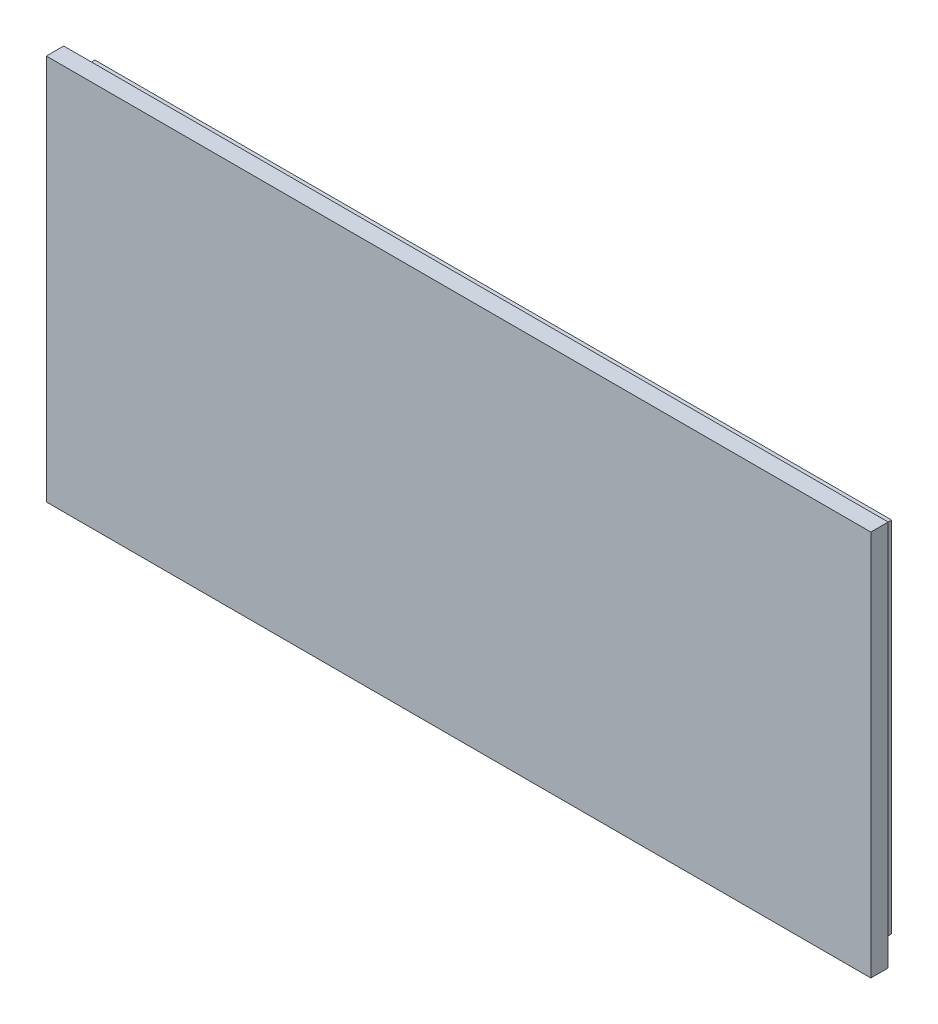
ISO-10303-21;
HEADER;
FILE_DESCRIPTION(('STEP AP214'),'2;1');
FILE_NAME('part.step','',(''),(''),'','','');
FILE_SCHEMA(('AUTOMOTIVE_DESIGN { 1 0 10303 214 1 1 1 1 }'));
ENDSEC;
DATA;
#1=APPLICATION_CONTEXT('core data for automotive mechanical design processes');
#2=APPLICATION_PROTOCOL_DEFINITION('international standard','automotive_design',2000,#1);
#3=PRODUCT_CONTEXT('',#1,'mechanical');
#4=PRODUCT('Part','Part','',(#3));
#5=PRODUCT_RELATED_PRODUCT_CATEGORY('part','',(#4));
#6=PRODUCT_DEFINITION_FORMATION('','',#4);
#7=PRODUCT_DEFINITION_CONTEXT('part definition',#1,'design');
#8=PRODUCT_DEFINITION('design','',#6,#7);
#9=PRODUCT_DEFINITION_SHAPE('','',#8);
#10=(LENGTH_UNIT() NAMED_UNIT(*) SI_UNIT(.MILLI.,.METRE.));
#11=(NAMED_UNIT(*) PLANE_ANGLE_UNIT() SI_UNIT($,.RADIAN.));
#12=(NAMED_UNIT(*) SI_UNIT($,.STERADIAN.) SOLID_ANGLE_UNIT());
#13=UNCERTAINTY_MEASURE_WITH_UNIT(LENGTH_MEASURE(1.E-05),#10,'distance_accuracy_value','');
#14=(GEOMETRIC_REPRESENTATION_CONTEXT(3) GLOBAL_UNCERTAINTY_ASSIGNED_CONTEXT((#13)) GLOBAL_UNIT_ASSIGNED_CONTEXT((#10,
#11,#12)) REPRESENTATION_CONTEXT('',''));
#15=CARTESIAN_POINT('',(0.,0.,0.));
#16=DIRECTION('',(0.,0.,1.));
#17=DIRECTION('',(1.,0.,0.));
#18=AXIS2_PLACEMENT_3D('',#15,#16,#17);
#19=CARTESIAN_POINT('',(0.,0.,0.));
#20=DIRECTION('',(0.,0.,1.));
#21=DIRECTION('',(1.,0.,0.));
#22=AXIS2_PLACEMENT_3D('',#19,#20,#21);
#23=PLANE('',#22);
#24=DIRECTION('',(0.,-1.,0.));
#25=VECTOR('',#24,1.);
#26=CARTESIAN_POINT('',(-115.5,48.,0.));
#27=LINE('',#26,#25);
#28=CARTESIAN_POINT('',(-115.5,48.,0.));
#29=VERTEX_POINT('',#28);
#30=CARTESIAN_POINT('',(-115.5,-41.,0.));
#31=VERTEX_POINT('',#30);
#32=EDGE_CURVE('E224',#29,#31,#27,.T.);
#33=ORIENTED_EDGE('',*,*,#32,.F.);
#34=DIRECTION('',(-1.,0.,0.));
#35=VECTOR('',#34,1.);
#36=CARTESIAN_POINT('',(-115.5,48.,0.));
#37=LINE('',#36,#35);
#38=CARTESIAN_POINT('',(74.5,48.,0.));
#39=VERTEX_POINT('',#38);
#40=EDGE_CURVE('E230',#39,#29,#37,.T.);
#41=ORIENTED_EDGE('',*,*,#40,.F.);
#42=DIRECTION('',(0.,1.,0.));
#43=VECTOR('',#42,1.);
#44=CARTESIAN_POINT('',(74.5,48.,0.));
#45=LINE('',#44,#43);
#46=CARTESIAN_POINT('',(74.5,-41.,0.));
#47=VERTEX_POINT('',#46);
#48=EDGE_CURVE('E246',#47,#39,#45,.T.);
#49=ORIENTED_EDGE('',*,*,#48,.F.);
#50=DIRECTION('',(1.,0.,0.));
#51=VECTOR('',#50,1.);
#52=CARTESIAN_POINT('',(-115.5,-41.,0.));
#53=LINE('',#52,#51);
#54=EDGE_CURVE('E243',#31,#47,#53,.T.);
#55=ORIENTED_EDGE('',*,*,#54,.F.);
#56=EDGE_LOOP('',(#33,#41,#49,#55));
#57=FACE_BOUND('',#56,.T.);
#58=DIRECTION('',(0.,1.,0.));
#59=VECTOR('',#58,1.);
#60=CARTESIAN_POINT('',(-112.3,-37.8,0.));
#61=LINE('',#60,#59);
#62=CARTESIAN_POINT('',(-112.3,-37.8,0.));
#63=VERTEX_POINT('',#62);
#64=CARTESIAN_POINT('',(-112.3,44.8,0.));
#65=VERTEX_POINT('',#64);
#66=EDGE_CURVE('E151',#63,#65,#61,.T.);
#67=ORIENTED_EDGE('',*,*,#66,.F.);
#68=DIRECTION('',(-1.,0.,0.));
#69=VECTOR('',#68,1.);
#70=CARTESIAN_POINT('',(71.3,-37.8,0.));
#71=LINE('',#70,#69);
#72=CARTESIAN_POINT('',(71.3,-37.8,0.));
#73=VERTEX_POINT('',#72);
#74=EDGE_CURVE('E190',#73,#63,#71,.T.);
#75=ORIENTED_EDGE('',*,*,#74,.F.);
#76=DIRECTION('',(0.,-1.,0.));
#77=VECTOR('',#76,1.);
#78=CARTESIAN_POINT('',(71.3,44.8,0.));
#79=LINE('',#78,#77);
#80=CARTESIAN_POINT('',(71.3,44.8,0.));
#81=VERTEX_POINT('',#80);
#82=EDGE_CURVE('E63',#81,#73,#79,.T.);
#83=ORIENTED_EDGE('',*,*,#82,.F.);
#84=DIRECTION('',(1.,0.,0.));
#85=VECTOR('',#84,1.);
#86=CARTESIAN_POINT('',(-112.3,44.8,0.));
#87=LINE('',#86,#85);
#88=EDGE_CURVE('E58',#65,#81,#87,.T.);
#89=ORIENTED_EDGE('',*,*,#88,.F.);
#90=EDGE_LOOP('',(#67,#75,#83,#89));
#91=FACE_BOUND('',#90,.T.);
#92=ADVANCED_FACE('F42',(#57,#91),#23,.F.);
#93=CARTESIAN_POINT('',(-115.5,48.,4.));
#94=DIRECTION('',(1.,0.,0.));
#95=DIRECTION('',(0.,0.,-1.));
#96=AXIS2_PLACEMENT_3D('',#93,#94,#95);
#97=PLANE('',#96);
#98=ORIENTED_EDGE('',*,*,#32,.T.);
#99=DIRECTION('',(0.,0.,-1.));
#100=VECTOR('',#99,1.);
#101=CARTESIAN_POINT('',(-115.5,-41.,4.));
#102=LINE('',#101,#100);
#103=CARTESIAN_POINT('',(-115.5,-41.,4.));
#104=VERTEX_POINT('',#103);
#105=EDGE_CURVE('E11',#104,#31,#102,.T.);
#106=ORIENTED_EDGE('',*,*,#105,.F.);
#107=DIRECTION('',(0.,-1.,0.));
#108=VECTOR('',#107,1.);
#109=CARTESIAN_POINT('',(-115.5,48.,4.));
#110=LINE('',#109,#108);
#111=CARTESIAN_POINT('',(-115.5,48.,4.));
#112=VERTEX_POINT('',#111);
#113=EDGE_CURVE('E225',#112,#104,#110,.T.);
#114=ORIENTED_EDGE('',*,*,#113,.F.);
#115=DIRECTION('',(0.,0.,-1.));
#116=VECTOR('',#115,1.);
#117=CARTESIAN_POINT('',(-115.5,48.,4.));
#118=LINE('',#117,#116);
#119=EDGE_CURVE('E239',#112,#29,#118,.T.);
#120=ORIENTED_EDGE('',*,*,#119,.T.);
#121=EDGE_LOOP('',(#98,#106,#114,#120));
#122=FACE_BOUND('',#121,.T.);
#123=ADVANCED_FACE('F44',(#122),#97,.F.);
#124=CARTESIAN_POINT('',(-115.5,-41.,4.));
#125=DIRECTION('',(0.,1.,0.));
#126=DIRECTION('',(0.,0.,1.));
#127=AXIS2_PLACEMENT_3D('',#124,#125,#126);
#128=PLANE('',#127);
#129=ORIENTED_EDGE('',*,*,#54,.T.);
#130=DIRECTION('',(0.,0.,-1.));
#131=VECTOR('',#130,1.);
#132=CARTESIAN_POINT('',(74.5,-41.,4.));
#133=LINE('',#132,#131);
#134=CARTESIAN_POINT('',(74.5,-41.,4.));
#135=VERTEX_POINT('',#134);
#136=EDGE_CURVE('E51',#135,#47,#133,.T.);
#137=ORIENTED_EDGE('',*,*,#136,.F.);
#138=DIRECTION('',(1.,0.,0.));
#139=VECTOR('',#138,1.);
#140=CARTESIAN_POINT('',(-115.5,-41.,4.));
#141=LINE('',#140,#139);
#142=EDGE_CURVE('E229',#104,#135,#141,.T.);
#143=ORIENTED_EDGE('',*,*,#142,.F.);
#144=ORIENTED_EDGE('',*,*,#105,.T.);
#145=EDGE_LOOP('',(#129,#137,#143,#144));
#146=FACE_BOUND('',#145,.T.);
#147=ADVANCED_FACE('F278',(#146),#128,.F.);
#148=CARTESIAN_POINT('',(74.5,48.,4.));
#149=DIRECTION('',(-1.,0.,0.));
#150=DIRECTION('',(0.,0.,1.));
#151=AXIS2_PLACEMENT_3D('',#148,#149,#150);
#152=PLANE('',#151);
#153=ORIENTED_EDGE('',*,*,#48,.T.);
#154=DIRECTION('',(0.,0.,-1.));
#155=VECTOR('',#154,1.);
#156=CARTESIAN_POINT('',(74.5,48.,4.));
#157=LINE('',#156,#155);
#158=CARTESIAN_POINT('',(74.5,48.,4.));
#159=VERTEX_POINT('',#158);
#160=EDGE_CURVE('E254',#159,#39,#157,.T.);
#161=ORIENTED_EDGE('',*,*,#160,.F.);
#162=DIRECTION('',(0.,1.,0.));
#163=VECTOR('',#162,1.);
#164=CARTESIAN_POINT('',(74.5,48.,4.));
#165=LINE('',#164,#163);
#166=EDGE_CURVE('E233',#135,#159,#165,.T.);
#167=ORIENTED_EDGE('',*,*,#166,.F.);
#168=ORIENTED_EDGE('',*,*,#136,.T.);
#169=EDGE_LOOP('',(#153,#161,#167,#168));
#170=FACE_BOUND('',#169,.T.);
#171=ADVANCED_FACE('F263',(#170),#152,.F.);
#172=CARTESIAN_POINT('',(-115.5,48.,4.));
#173=DIRECTION('',(0.,-1.,0.));
#174=DIRECTION('',(0.,0.,-1.));
#175=AXIS2_PLACEMENT_3D('',#172,#173,#174);
#176=PLANE('',#175);
#177=ORIENTED_EDGE('',*,*,#40,.T.);
#178=ORIENTED_EDGE('',*,*,#119,.F.);
#179=DIRECTION('',(-1.,0.,0.));
#180=VECTOR('',#179,1.);
#181=CARTESIAN_POINT('',(-115.5,48.,4.));
#182=LINE('',#181,#180);
#183=EDGE_CURVE('E236',#159,#112,#182,.T.);
#184=ORIENTED_EDGE('',*,*,#183,.F.);
#185=ORIENTED_EDGE('',*,*,#160,.T.);
#186=EDGE_LOOP('',(#177,#178,#184,#185));
#187=FACE_BOUND('',#186,.T.);
#188=ADVANCED_FACE('F271',(#187),#176,.F.);
#189=CARTESIAN_POINT('',(0.,0.,4.));
#190=DIRECTION('',(0.,0.,1.));
#191=DIRECTION('',(1.,0.,0.));
#192=AXIS2_PLACEMENT_3D('',#189,#190,#191);
#193=PLANE('',#192);
#194=ORIENTED_EDGE('',*,*,#113,.T.);
#195=ORIENTED_EDGE('',*,*,#142,.T.);
#196=ORIENTED_EDGE('',*,*,#166,.T.);
#197=ORIENTED_EDGE('',*,*,#183,.T.);
#198=EDGE_LOOP('',(#194,#195,#196,#197));
#199=FACE_BOUND('',#198,.T.);
#200=ADVANCED_FACE('F277',(#199),#193,.T.);
#201=CARTESIAN_POINT('',(0.,0.,-4.));
#202=DIRECTION('',(0.,0.,-1.));
#203=DIRECTION('',(-1.,0.,0.));
#204=AXIS2_PLACEMENT_3D('',#201,#202,#203);
#205=PLANE('',#204);
#206=DIRECTION('',(0.,1.,0.));
#207=VECTOR('',#206,1.);
#208=CARTESIAN_POINT('',(-112.3,-37.8,-4.));
#209=LINE('',#208,#207);
#210=CARTESIAN_POINT('',(-112.3,-37.8,-4.));
#211=VERTEX_POINT('',#210);
#212=CARTESIAN_POINT('',(-112.3,44.8,-4.));
#213=VERTEX_POINT('',#212);
#214=EDGE_CURVE('E185',#211,#213,#209,.T.);
#215=ORIENTED_EDGE('',*,*,#214,.T.);
#216=DIRECTION('',(1.,0.,0.));
#217=VECTOR('',#216,1.);
#218=CARTESIAN_POINT('',(-112.3,44.8,-4.));
#219=LINE('',#218,#217);
#220=CARTESIAN_POINT('',(71.3,44.8,-4.));
#221=VERTEX_POINT('',#220);
#222=EDGE_CURVE('E189',#213,#221,#219,.T.);
#223=ORIENTED_EDGE('',*,*,#222,.T.);
#224=DIRECTION('',(0.,-1.,0.));
#225=VECTOR('',#224,1.);
#226=CARTESIAN_POINT('',(71.3,44.8,-4.));
#227=LINE('',#226,#225);
#228=CARTESIAN_POINT('',(71.3,-37.8,-4.));
#229=VERTEX_POINT('',#228);
#230=EDGE_CURVE('E193',#221,#229,#227,.T.);
#231=ORIENTED_EDGE('',*,*,#230,.T.);
#232=DIRECTION('',(-1.,0.,0.));
#233=VECTOR('',#232,1.);
#234=CARTESIAN_POINT('',(71.3,-37.8,-4.));
#235=LINE('',#234,#233);
#236=EDGE_CURVE('E196',#229,#211,#235,.T.);
#237=ORIENTED_EDGE('',*,*,#236,.T.);
#238=EDGE_LOOP('',(#215,#223,#231,#237));
#239=FACE_BOUND('',#238,.T.);
#240=DIRECTION('',(0.,1.,0.));
#241=VECTOR('',#240,1.);
#242=CARTESIAN_POINT('',(-110.3,-35.8,-4.));
#243=LINE('',#242,#241);
#244=CARTESIAN_POINT('',(-110.3,-35.8,-4.));
#245=VERTEX_POINT('',#244);
#246=CARTESIAN_POINT('',(-110.3,42.8,-4.));
#247=VERTEX_POINT('',#246);
#248=EDGE_CURVE('E142',#245,#247,#243,.T.);
#249=ORIENTED_EDGE('',*,*,#248,.F.);
#250=DIRECTION('',(-1.,0.,0.));
#251=VECTOR('',#250,1.);
#252=CARTESIAN_POINT('',(69.3,-35.8,-4.));
#253=LINE('',#252,#251);
#254=CARTESIAN_POINT('',(69.3,-35.8,-4.));
#255=VERTEX_POINT('',#254);
#256=EDGE_CURVE('E131',#255,#245,#253,.T.);
#257=ORIENTED_EDGE('',*,*,#256,.F.);
#258=DIRECTION('',(0.,-1.,0.));
#259=VECTOR('',#258,1.);
#260=CARTESIAN_POINT('',(69.3,42.8,-4.));
#261=LINE('',#260,#259);
#262=CARTESIAN_POINT('',(69.3,42.8,-4.));
#263=VERTEX_POINT('',#262);
#264=EDGE_CURVE('E161',#263,#255,#261,.T.);
#265=ORIENTED_EDGE('',*,*,#264,.F.);
#266=DIRECTION('',(1.,0.,0.));
#267=VECTOR('',#266,1.);
#268=CARTESIAN_POINT('',(-110.3,42.8,-4.));
#269=LINE('',#268,#267);
#270=EDGE_CURVE('E157',#247,#263,#269,.T.);
#271=ORIENTED_EDGE('',*,*,#270,.F.);
#272=EDGE_LOOP('',(#249,#257,#265,#271));
#273=FACE_BOUND('',#272,.T.);
#274=ADVANCED_FACE('F155',(#239,#273),#205,.T.);
#275=CARTESIAN_POINT('',(-112.3,-37.8,-4.));
#276=DIRECTION('',(1.,0.,0.));
#277=DIRECTION('',(0.,0.,-1.));
#278=AXIS2_PLACEMENT_3D('',#275,#276,#277);
#279=PLANE('',#278);
#280=ORIENTED_EDGE('',*,*,#66,.T.);
#281=DIRECTION('',(0.,0.,1.));
#282=VECTOR('',#281,1.);
#283=CARTESIAN_POINT('',(-112.3,44.8,-4.));
#284=LINE('',#283,#282);
#285=EDGE_CURVE('E221',#213,#65,#284,.T.);
#286=ORIENTED_EDGE('',*,*,#285,.F.);
#287=ORIENTED_EDGE('',*,*,#214,.F.);
#288=DIRECTION('',(0.,0.,1.));
#289=VECTOR('',#288,1.);
#290=CARTESIAN_POINT('',(-112.3,-37.8,-4.));
#291=LINE('',#290,#289);
#292=EDGE_CURVE('E199',#211,#63,#291,.T.);
#293=ORIENTED_EDGE('',*,*,#292,.T.);
#294=EDGE_LOOP('',(#280,#286,#287,#293));
#295=FACE_BOUND('',#294,.T.);
#296=ADVANCED_FACE('F316',(#295),#279,.F.);
#297=CARTESIAN_POINT('',(-112.3,44.8,-4.));
#298=DIRECTION('',(0.,-1.,0.));
#299=DIRECTION('',(0.,0.,-1.));
#300=AXIS2_PLACEMENT_3D('',#297,#298,#299);
#301=PLANE('',#300);
#302=ORIENTED_EDGE('',*,*,#88,.T.);
#303=DIRECTION('',(0.,0.,1.));
#304=VECTOR('',#303,1.);
#305=CARTESIAN_POINT('',(71.3,44.8,-4.));
#306=LINE('',#305,#304);
#307=EDGE_CURVE('E217',#221,#81,#306,.T.);
#308=ORIENTED_EDGE('',*,*,#307,.F.);
#309=ORIENTED_EDGE('',*,*,#222,.F.);
#310=ORIENTED_EDGE('',*,*,#285,.T.);
#311=EDGE_LOOP('',(#302,#308,#309,#310));
#312=FACE_BOUND('',#311,.T.);
#313=ADVANCED_FACE('F324',(#312),#301,.F.);
#314=CARTESIAN_POINT('',(71.3,44.8,-4.));
#315=DIRECTION('',(-1.,0.,0.));
#316=DIRECTION('',(0.,0.,1.));
#317=AXIS2_PLACEMENT_3D('',#314,#315,#316);
#318=PLANE('',#317);
#319=ORIENTED_EDGE('',*,*,#82,.T.);
#320=DIRECTION('',(0.,0.,1.));
#321=VECTOR('',#320,1.);
#322=CARTESIAN_POINT('',(71.3,-37.8,-4.));
#323=LINE('',#322,#321);
#324=EDGE_CURVE('E213',#229,#73,#323,.T.);
#325=ORIENTED_EDGE('',*,*,#324,.F.);
#326=ORIENTED_EDGE('',*,*,#230,.F.);
#327=ORIENTED_EDGE('',*,*,#307,.T.);
#328=EDGE_LOOP('',(#319,#325,#326,#327));
#329=FACE_BOUND('',#328,.T.);
#330=ADVANCED_FACE('F320',(#329),#318,.F.);
#331=CARTESIAN_POINT('',(71.3,-37.8,-4.));
#332=DIRECTION('',(0.,1.,0.));
#333=DIRECTION('',(0.,0.,1.));
#334=AXIS2_PLACEMENT_3D('',#331,#332,#333);
#335=PLANE('',#334);
#336=ORIENTED_EDGE('',*,*,#74,.T.);
#337=ORIENTED_EDGE('',*,*,#292,.F.);
#338=ORIENTED_EDGE('',*,*,#236,.F.);
#339=ORIENTED_EDGE('',*,*,#324,.T.);
#340=EDGE_LOOP('',(#336,#337,#338,#339));
#341=FACE_BOUND('',#340,.T.);
#342=ADVANCED_FACE('F313',(#341),#335,.F.);
#343=CARTESIAN_POINT('',(69.3,-35.8,-4.));
#344=DIRECTION('',(0.,1.,0.));
#345=DIRECTION('',(0.,0.,1.));
#346=AXIS2_PLACEMENT_3D('',#343,#344,#345);
#347=PLANE('',#346);
#348=DIRECTION('',(-1.,0.,0.));
#349=VECTOR('',#348,1.);
#350=CARTESIAN_POINT('',(69.3,-35.8,0.));
#351=LINE('',#350,#349);
#352=CARTESIAN_POINT('',(69.3,-35.8,0.));
#353=VERTEX_POINT('',#352);
#354=CARTESIAN_POINT('',(-110.3,-35.8,0.));
#355=VERTEX_POINT('',#354);
#356=EDGE_CURVE('E166',#353,#355,#351,.T.);
#357=ORIENTED_EDGE('',*,*,#356,.F.);
#358=DIRECTION('',(0.,0.,1.));
#359=VECTOR('',#358,1.);
#360=CARTESIAN_POINT('',(69.3,-35.8,-4.));
#361=LINE('',#360,#359);
#362=EDGE_CURVE('E137',#255,#353,#361,.T.);
#363=ORIENTED_EDGE('',*,*,#362,.F.);
#364=ORIENTED_EDGE('',*,*,#256,.T.);
#365=DIRECTION('',(0.,0.,1.));
#366=VECTOR('',#365,1.);
#367=CARTESIAN_POINT('',(-110.3,-35.8,-4.));
#368=LINE('',#367,#366);
#369=EDGE_CURVE('E135',#245,#355,#368,.T.);
#370=ORIENTED_EDGE('',*,*,#369,.T.);
#371=EDGE_LOOP('',(#357,#363,#364,#370));
#372=FACE_BOUND('',#371,.T.);
#373=ADVANCED_FACE('F134',(#372),#347,.T.);
#374=CARTESIAN_POINT('',(-110.3,-35.8,-4.));
#375=DIRECTION('',(1.,0.,0.));
#376=DIRECTION('',(0.,0.,-1.));
#377=AXIS2_PLACEMENT_3D('',#374,#375,#376);
#378=PLANE('',#377);
#379=DIRECTION('',(0.,1.,0.));
#380=VECTOR('',#379,1.);
#381=CARTESIAN_POINT('',(-110.3,-35.8,0.));
#382=LINE('',#381,#380);
#383=CARTESIAN_POINT('',(-110.3,42.8,0.));
#384=VERTEX_POINT('',#383);
#385=EDGE_CURVE('E149',#355,#384,#382,.T.);
#386=ORIENTED_EDGE('',*,*,#385,.F.);
#387=ORIENTED_EDGE('',*,*,#369,.F.);
#388=ORIENTED_EDGE('',*,*,#248,.T.);
#389=DIRECTION('',(0.,0.,1.));
#390=VECTOR('',#389,1.);
#391=CARTESIAN_POINT('',(-110.3,42.8,-4.));
#392=LINE('',#391,#390);
#393=EDGE_CURVE('E152',#247,#384,#392,.T.);
#394=ORIENTED_EDGE('',*,*,#393,.T.);
#395=EDGE_LOOP('',(#386,#387,#388,#394));
#396=FACE_BOUND('',#395,.T.);
#397=ADVANCED_FACE('F146',(#396),#378,.T.);
#398=CARTESIAN_POINT('',(-110.3,42.8,-4.));
#399=DIRECTION('',(0.,-1.,0.));
#400=DIRECTION('',(0.,0.,-1.));
#401=AXIS2_PLACEMENT_3D('',#398,#399,#400);
#402=PLANE('',#401);
#403=DIRECTION('',(1.,0.,0.));
#404=VECTOR('',#403,1.);
#405=CARTESIAN_POINT('',(-110.3,42.8,0.));
#406=LINE('',#405,#404);
#407=CARTESIAN_POINT('',(69.3,42.8,0.));
#408=VERTEX_POINT('',#407);
#409=EDGE_CURVE('E171',#384,#408,#406,.T.);
#410=ORIENTED_EDGE('',*,*,#409,.F.);
#411=ORIENTED_EDGE('',*,*,#393,.F.);
#412=ORIENTED_EDGE('',*,*,#270,.T.);
#413=DIRECTION('',(0.,0.,1.));
#414=VECTOR('',#413,1.);
#415=CARTESIAN_POINT('',(69.3,42.8,-4.));
#416=LINE('',#415,#414);
#417=EDGE_CURVE('E180',#263,#408,#416,.T.);
#418=ORIENTED_EDGE('',*,*,#417,.T.);
#419=EDGE_LOOP('',(#410,#411,#412,#418));
#420=FACE_BOUND('',#419,.T.);
#421=ADVANCED_FACE('F298',(#420),#402,.T.);
#422=CARTESIAN_POINT('',(69.3,42.8,-4.));
#423=DIRECTION('',(-1.,0.,0.));
#424=DIRECTION('',(0.,0.,1.));
#425=AXIS2_PLACEMENT_3D('',#422,#423,#424);
#426=PLANE('',#425);
#427=DIRECTION('',(0.,-1.,0.));
#428=VECTOR('',#427,1.);
#429=CARTESIAN_POINT('',(69.3,42.8,0.));
#430=LINE('',#429,#428);
#431=EDGE_CURVE('E143',#408,#353,#430,.T.);
#432=ORIENTED_EDGE('',*,*,#431,.F.);
#433=ORIENTED_EDGE('',*,*,#417,.F.);
#434=ORIENTED_EDGE('',*,*,#264,.T.);
#435=ORIENTED_EDGE('',*,*,#362,.T.);
#436=EDGE_LOOP('',(#432,#433,#434,#435));
#437=FACE_BOUND('',#436,.T.);
#438=ADVANCED_FACE('F293',(#437),#426,.T.);
#439=ORIENTED_EDGE('',*,*,#431,.T.);
#440=ORIENTED_EDGE('',*,*,#356,.T.);
#441=ORIENTED_EDGE('',*,*,#385,.T.);
#442=ORIENTED_EDGE('',*,*,#409,.T.);
#443=EDGE_LOOP('',(#439,#440,#441,#442));
#444=FACE_BOUND('',#443,.T.);
#445=ADVANCED_FACE('F287',(#444),#23,.F.);
#446=CLOSED_SHELL('',(#92,#123,#147,#171,#188,#200,#274,#296,#313,#330,#342,#373,#397,#421,#438,#445));
#447=MANIFOLD_SOLID_BREP('B2',#446);
#448=ADVANCED_BREP_SHAPE_REPRESENTATION('',(#18,#447),#14);
#449=SHAPE_DEFINITION_REPRESENTATION(#9,#448);
ENDSEC;
END-ISO-10303-21;
